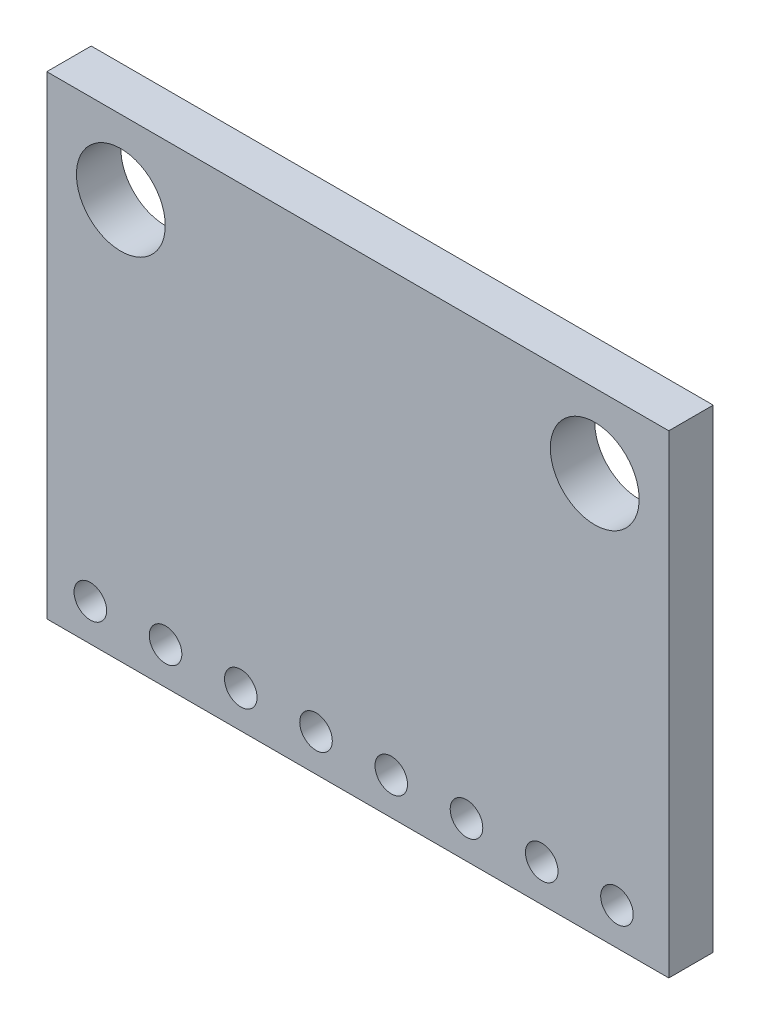
ISO-10303-21;
HEADER;
FILE_DESCRIPTION(('STEP AP214'),'2;1');
FILE_NAME('part.step','',(''),(''),'','','');
FILE_SCHEMA(('AUTOMOTIVE_DESIGN { 1 0 10303 214 1 1 1 1 }'));
ENDSEC;
DATA;
#1=APPLICATION_CONTEXT('core data for automotive mechanical design processes');
#2=APPLICATION_PROTOCOL_DEFINITION('international standard','automotive_design',2000,#1);
#3=PRODUCT_CONTEXT('',#1,'mechanical');
#4=PRODUCT('Part','Part','',(#3));
#5=PRODUCT_RELATED_PRODUCT_CATEGORY('part','',(#4));
#6=PRODUCT_DEFINITION_FORMATION('','',#4);
#7=PRODUCT_DEFINITION_CONTEXT('part definition',#1,'design');
#8=PRODUCT_DEFINITION('design','',#6,#7);
#9=PRODUCT_DEFINITION_SHAPE('','',#8);
#10=(LENGTH_UNIT() NAMED_UNIT(*) SI_UNIT(.MILLI.,.METRE.));
#11=(NAMED_UNIT(*) PLANE_ANGLE_UNIT() SI_UNIT($,.RADIAN.));
#12=(NAMED_UNIT(*) SI_UNIT($,.STERADIAN.) SOLID_ANGLE_UNIT());
#13=UNCERTAINTY_MEASURE_WITH_UNIT(LENGTH_MEASURE(1.E-05),#10,'distance_accuracy_value','');
#14=(GEOMETRIC_REPRESENTATION_CONTEXT(3) GLOBAL_UNCERTAINTY_ASSIGNED_CONTEXT((#13)) GLOBAL_UNIT_ASSIGNED_CONTEXT((#10,
#11,#12)) REPRESENTATION_CONTEXT('',''));
#15=CARTESIAN_POINT('',(0.,0.,0.));
#16=DIRECTION('',(0.,0.,1.));
#17=DIRECTION('',(1.,0.,0.));
#18=AXIS2_PLACEMENT_3D('',#15,#16,#17);
#19=CARTESIAN_POINT('',(0.,0.,1.5));
#20=DIRECTION('',(0.,0.,1.));
#21=DIRECTION('',(1.,0.,0.));
#22=AXIS2_PLACEMENT_3D('',#19,#20,#21);
#23=PLANE('',#22);
#24=CARTESIAN_POINT('',(8.75,-6.75,1.5));
#25=DIRECTION('',(0.,0.,1.));
#26=DIRECTION('',(1.,0.,0.));
#27=AXIS2_PLACEMENT_3D('',#24,#25,#26);
#28=CIRCLE('',#27,0.55);
#29=CARTESIAN_POINT('',(9.3,-6.75,1.5));
#30=VERTEX_POINT('',#29);
#31=EDGE_CURVE('E141',#30,#30,#28,.F.);
#32=ORIENTED_EDGE('',*,*,#31,.T.);
#33=EDGE_LOOP('',(#32));
#34=FACE_BOUND('',#33,.T.);
#35=CARTESIAN_POINT('',(6.21,-6.75,1.5));
#36=DIRECTION('',(0.,0.,1.));
#37=DIRECTION('',(1.,0.,0.));
#38=AXIS2_PLACEMENT_3D('',#35,#36,#37);
#39=CIRCLE('',#38,0.55);
#40=CARTESIAN_POINT('',(6.76,-6.75,1.5));
#41=VERTEX_POINT('',#40);
#42=EDGE_CURVE('E194',#41,#41,#39,.F.);
#43=ORIENTED_EDGE('',*,*,#42,.T.);
#44=EDGE_LOOP('',(#43));
#45=FACE_BOUND('',#44,.T.);
#46=CARTESIAN_POINT('',(3.67,-6.75,1.5));
#47=DIRECTION('',(0.,0.,1.));
#48=DIRECTION('',(1.,0.,0.));
#49=AXIS2_PLACEMENT_3D('',#46,#47,#48);
#50=CIRCLE('',#49,0.55);
#51=CARTESIAN_POINT('',(4.22,-6.75,1.5));
#52=VERTEX_POINT('',#51);
#53=EDGE_CURVE('E186',#52,#52,#50,.F.);
#54=ORIENTED_EDGE('',*,*,#53,.T.);
#55=EDGE_LOOP('',(#54));
#56=FACE_BOUND('',#55,.T.);
#57=CARTESIAN_POINT('',(1.13,-6.75,1.5));
#58=DIRECTION('',(0.,0.,1.));
#59=DIRECTION('',(1.,0.,0.));
#60=AXIS2_PLACEMENT_3D('',#57,#58,#59);
#61=CIRCLE('',#60,0.55);
#62=CARTESIAN_POINT('',(1.68,-6.75,1.5));
#63=VERTEX_POINT('',#62);
#64=EDGE_CURVE('E178',#63,#63,#61,.F.);
#65=ORIENTED_EDGE('',*,*,#64,.T.);
#66=EDGE_LOOP('',(#65));
#67=FACE_BOUND('',#66,.T.);
#68=CARTESIAN_POINT('',(-1.41,-6.75,1.5));
#69=DIRECTION('',(0.,0.,1.));
#70=DIRECTION('',(1.,0.,0.));
#71=AXIS2_PLACEMENT_3D('',#68,#69,#70);
#72=CIRCLE('',#71,0.55);
#73=CARTESIAN_POINT('',(-0.860000000000002,-6.75,1.5));
#74=VERTEX_POINT('',#73);
#75=EDGE_CURVE('E170',#74,#74,#72,.F.);
#76=ORIENTED_EDGE('',*,*,#75,.T.);
#77=EDGE_LOOP('',(#76));
#78=FACE_BOUND('',#77,.T.);
#79=CARTESIAN_POINT('',(-3.95,-6.75,1.5));
#80=DIRECTION('',(0.,0.,1.));
#81=DIRECTION('',(1.,0.,0.));
#82=AXIS2_PLACEMENT_3D('',#79,#80,#81);
#83=CIRCLE('',#82,0.55);
#84=CARTESIAN_POINT('',(-3.4,-6.75,1.5));
#85=VERTEX_POINT('',#84);
#86=EDGE_CURVE('E162',#85,#85,#83,.F.);
#87=ORIENTED_EDGE('',*,*,#86,.T.);
#88=EDGE_LOOP('',(#87));
#89=FACE_BOUND('',#88,.T.);
#90=CARTESIAN_POINT('',(-6.49,-6.75,1.5));
#91=DIRECTION('',(0.,0.,1.));
#92=DIRECTION('',(1.,0.,0.));
#93=AXIS2_PLACEMENT_3D('',#90,#91,#92);
#94=CIRCLE('',#93,0.55);
#95=CARTESIAN_POINT('',(-5.94,-6.75,1.5));
#96=VERTEX_POINT('',#95);
#97=EDGE_CURVE('E154',#96,#96,#94,.F.);
#98=ORIENTED_EDGE('',*,*,#97,.T.);
#99=EDGE_LOOP('',(#98));
#100=FACE_BOUND('',#99,.T.);
#101=CARTESIAN_POINT('',(-9.03,-6.75,1.5));
#102=DIRECTION('',(0.,0.,1.));
#103=DIRECTION('',(1.,0.,0.));
#104=AXIS2_PLACEMENT_3D('',#101,#102,#103);
#105=CIRCLE('',#104,0.55);
#106=CARTESIAN_POINT('',(-8.48,-6.75,1.5));
#107=VERTEX_POINT('',#106);
#108=EDGE_CURVE('E145',#107,#107,#105,.F.);
#109=ORIENTED_EDGE('',*,*,#108,.T.);
#110=EDGE_LOOP('',(#109));
#111=FACE_BOUND('',#110,.T.);
#112=CARTESIAN_POINT('',(-8.,5.5,1.5));
#113=DIRECTION('',(0.,0.,1.));
#114=DIRECTION('',(1.,0.,0.));
#115=AXIS2_PLACEMENT_3D('',#112,#113,#114);
#116=CIRCLE('',#115,1.5);
#117=CARTESIAN_POINT('',(-6.5,5.5,1.5));
#118=VERTEX_POINT('',#117);
#119=EDGE_CURVE('E111',#118,#118,#116,.T.);
#120=ORIENTED_EDGE('',*,*,#119,.F.);
#121=EDGE_LOOP('',(#120));
#122=FACE_BOUND('',#121,.T.);
#123=DIRECTION('',(0.,-1.,0.));
#124=VECTOR('',#123,1.);
#125=CARTESIAN_POINT('',(-10.5,-8.,1.5));
#126=LINE('',#125,#124);
#127=CARTESIAN_POINT('',(-10.5,8.,1.5));
#128=VERTEX_POINT('',#127);
#129=CARTESIAN_POINT('',(-10.5,-8.,1.5));
#130=VERTEX_POINT('',#129);
#131=EDGE_CURVE('E91',#128,#130,#126,.T.);
#132=ORIENTED_EDGE('',*,*,#131,.T.);
#133=DIRECTION('',(1.,0.,0.));
#134=VECTOR('',#133,1.);
#135=CARTESIAN_POINT('',(10.5,-8.,1.5));
#136=LINE('',#135,#134);
#137=CARTESIAN_POINT('',(10.5,-8.,1.5));
#138=VERTEX_POINT('',#137);
#139=EDGE_CURVE('E86',#130,#138,#136,.T.);
#140=ORIENTED_EDGE('',*,*,#139,.T.);
#141=DIRECTION('',(0.,1.,0.));
#142=VECTOR('',#141,1.);
#143=CARTESIAN_POINT('',(10.5,-8.,1.5));
#144=LINE('',#143,#142);
#145=CARTESIAN_POINT('',(10.5,8.,1.5));
#146=VERTEX_POINT('',#145);
#147=EDGE_CURVE('E89',#138,#146,#144,.T.);
#148=ORIENTED_EDGE('',*,*,#147,.T.);
#149=DIRECTION('',(-1.,0.,0.));
#150=VECTOR('',#149,1.);
#151=CARTESIAN_POINT('',(10.5,8.,1.5));
#152=LINE('',#151,#150);
#153=EDGE_CURVE('E56',#146,#128,#152,.T.);
#154=ORIENTED_EDGE('',*,*,#153,.T.);
#155=EDGE_LOOP('',(#132,#140,#148,#154));
#156=FACE_BOUND('',#155,.T.);
#157=CARTESIAN_POINT('',(8.,5.5,1.5));
#158=DIRECTION('',(0.,0.,1.));
#159=DIRECTION('',(-1.,0.,0.));
#160=AXIS2_PLACEMENT_3D('',#157,#158,#159);
#161=CIRCLE('',#160,1.5);
#162=CARTESIAN_POINT('',(6.5,5.5,1.5));
#163=VERTEX_POINT('',#162);
#164=EDGE_CURVE('E133',#163,#163,#161,.T.);
#165=ORIENTED_EDGE('',*,*,#164,.F.);
#166=EDGE_LOOP('',(#165));
#167=FACE_BOUND('',#166,.T.);
#168=ADVANCED_FACE('F38',(#34,#45,#56,#67,#78,#89,#100,#111,#122,#156,#167),#23,.T.);
#169=CARTESIAN_POINT('',(0.,0.,0.));
#170=DIRECTION('',(0.,0.,1.));
#171=DIRECTION('',(1.,0.,0.));
#172=AXIS2_PLACEMENT_3D('',#169,#170,#171);
#173=PLANE('',#172);
#174=CARTESIAN_POINT('',(8.75,-6.75,0.));
#175=DIRECTION('',(0.,0.,-1.));
#176=DIRECTION('',(-1.,0.,0.));
#177=AXIS2_PLACEMENT_3D('',#174,#175,#176);
#178=CIRCLE('',#177,0.55);
#179=CARTESIAN_POINT('',(8.2,-6.75,0.));
#180=VERTEX_POINT('',#179);
#181=EDGE_CURVE('E198',#180,#180,#178,.T.);
#182=ORIENTED_EDGE('',*,*,#181,.F.);
#183=EDGE_LOOP('',(#182));
#184=FACE_BOUND('',#183,.T.);
#185=CARTESIAN_POINT('',(6.21,-6.75,0.));
#186=DIRECTION('',(0.,0.,-1.));
#187=DIRECTION('',(-1.,0.,0.));
#188=AXIS2_PLACEMENT_3D('',#185,#186,#187);
#189=CIRCLE('',#188,0.55);
#190=CARTESIAN_POINT('',(5.66,-6.75,0.));
#191=VERTEX_POINT('',#190);
#192=EDGE_CURVE('E190',#191,#191,#189,.T.);
#193=ORIENTED_EDGE('',*,*,#192,.F.);
#194=EDGE_LOOP('',(#193));
#195=FACE_BOUND('',#194,.T.);
#196=CARTESIAN_POINT('',(3.67,-6.75,0.));
#197=DIRECTION('',(0.,0.,-1.));
#198=DIRECTION('',(-1.,0.,0.));
#199=AXIS2_PLACEMENT_3D('',#196,#197,#198);
#200=CIRCLE('',#199,0.55);
#201=CARTESIAN_POINT('',(3.12,-6.75,0.));
#202=VERTEX_POINT('',#201);
#203=EDGE_CURVE('E182',#202,#202,#200,.T.);
#204=ORIENTED_EDGE('',*,*,#203,.F.);
#205=EDGE_LOOP('',(#204));
#206=FACE_BOUND('',#205,.T.);
#207=CARTESIAN_POINT('',(1.13,-6.75,0.));
#208=DIRECTION('',(0.,0.,-1.));
#209=DIRECTION('',(-1.,0.,0.));
#210=AXIS2_PLACEMENT_3D('',#207,#208,#209);
#211=CIRCLE('',#210,0.55);
#212=CARTESIAN_POINT('',(0.579999999999999,-6.75,0.));
#213=VERTEX_POINT('',#212);
#214=EDGE_CURVE('E174',#213,#213,#211,.T.);
#215=ORIENTED_EDGE('',*,*,#214,.F.);
#216=EDGE_LOOP('',(#215));
#217=FACE_BOUND('',#216,.T.);
#218=CARTESIAN_POINT('',(-1.41,-6.75,0.));
#219=DIRECTION('',(0.,0.,-1.));
#220=DIRECTION('',(-1.,0.,0.));
#221=AXIS2_PLACEMENT_3D('',#218,#219,#220);
#222=CIRCLE('',#221,0.55);
#223=CARTESIAN_POINT('',(-1.96,-6.75,0.));
#224=VERTEX_POINT('',#223);
#225=EDGE_CURVE('E166',#224,#224,#222,.T.);
#226=ORIENTED_EDGE('',*,*,#225,.F.);
#227=EDGE_LOOP('',(#226));
#228=FACE_BOUND('',#227,.T.);
#229=CARTESIAN_POINT('',(-3.95,-6.75,0.));
#230=DIRECTION('',(0.,0.,-1.));
#231=DIRECTION('',(-1.,0.,0.));
#232=AXIS2_PLACEMENT_3D('',#229,#230,#231);
#233=CIRCLE('',#232,0.55);
#234=CARTESIAN_POINT('',(-4.5,-6.75,0.));
#235=VERTEX_POINT('',#234);
#236=EDGE_CURVE('E158',#235,#235,#233,.T.);
#237=ORIENTED_EDGE('',*,*,#236,.F.);
#238=EDGE_LOOP('',(#237));
#239=FACE_BOUND('',#238,.T.);
#240=CARTESIAN_POINT('',(-6.49,-6.75,0.));
#241=DIRECTION('',(0.,0.,-1.));
#242=DIRECTION('',(-1.,0.,0.));
#243=AXIS2_PLACEMENT_3D('',#240,#241,#242);
#244=CIRCLE('',#243,0.55);
#245=CARTESIAN_POINT('',(-7.04,-6.75,0.));
#246=VERTEX_POINT('',#245);
#247=EDGE_CURVE('E149',#246,#246,#244,.T.);
#248=ORIENTED_EDGE('',*,*,#247,.F.);
#249=EDGE_LOOP('',(#248));
#250=FACE_BOUND('',#249,.T.);
#251=CARTESIAN_POINT('',(-9.03,-6.75,0.));
#252=DIRECTION('',(0.,0.,-1.));
#253=DIRECTION('',(-1.,0.,0.));
#254=AXIS2_PLACEMENT_3D('',#251,#252,#253);
#255=CIRCLE('',#254,0.55);
#256=CARTESIAN_POINT('',(-9.58,-6.75,0.));
#257=VERTEX_POINT('',#256);
#258=EDGE_CURVE('E150',#257,#257,#255,.T.);
#259=ORIENTED_EDGE('',*,*,#258,.F.);
#260=EDGE_LOOP('',(#259));
#261=FACE_BOUND('',#260,.T.);
#262=DIRECTION('',(0.,-1.,0.));
#263=VECTOR('',#262,1.);
#264=CARTESIAN_POINT('',(-10.5,-8.,0.));
#265=LINE('',#264,#263);
#266=CARTESIAN_POINT('',(-10.5,8.,0.));
#267=VERTEX_POINT('',#266);
#268=CARTESIAN_POINT('',(-10.5,-8.,0.));
#269=VERTEX_POINT('',#268);
#270=EDGE_CURVE('E107',#267,#269,#265,.T.);
#271=ORIENTED_EDGE('',*,*,#270,.F.);
#272=DIRECTION('',(-1.,0.,0.));
#273=VECTOR('',#272,1.);
#274=CARTESIAN_POINT('',(10.5,8.,0.));
#275=LINE('',#274,#273);
#276=CARTESIAN_POINT('',(10.5,8.,0.));
#277=VERTEX_POINT('',#276);
#278=EDGE_CURVE('E79',#277,#267,#275,.T.);
#279=ORIENTED_EDGE('',*,*,#278,.F.);
#280=DIRECTION('',(0.,1.,0.));
#281=VECTOR('',#280,1.);
#282=CARTESIAN_POINT('',(10.5,-8.,0.));
#283=LINE('',#282,#281);
#284=CARTESIAN_POINT('',(10.5,-8.,0.));
#285=VERTEX_POINT('',#284);
#286=EDGE_CURVE('E73',#285,#277,#283,.T.);
#287=ORIENTED_EDGE('',*,*,#286,.F.);
#288=DIRECTION('',(1.,0.,0.));
#289=VECTOR('',#288,1.);
#290=CARTESIAN_POINT('',(10.5,-8.,0.));
#291=LINE('',#290,#289);
#292=EDGE_CURVE('E96',#269,#285,#291,.T.);
#293=ORIENTED_EDGE('',*,*,#292,.F.);
#294=EDGE_LOOP('',(#271,#279,#287,#293));
#295=FACE_BOUND('',#294,.T.);
#296=CARTESIAN_POINT('',(-8.,5.5,0.));
#297=DIRECTION('',(0.,0.,1.));
#298=DIRECTION('',(1.,0.,0.));
#299=AXIS2_PLACEMENT_3D('',#296,#297,#298);
#300=CIRCLE('',#299,1.5);
#301=CARTESIAN_POINT('',(-6.5,5.5,0.));
#302=VERTEX_POINT('',#301);
#303=EDGE_CURVE('E129',#302,#302,#300,.T.);
#304=ORIENTED_EDGE('',*,*,#303,.T.);
#305=EDGE_LOOP('',(#304));
#306=FACE_BOUND('',#305,.T.);
#307=CARTESIAN_POINT('',(8.,5.5,0.));
#308=DIRECTION('',(0.,0.,1.));
#309=DIRECTION('',(-1.,0.,0.));
#310=AXIS2_PLACEMENT_3D('',#307,#308,#309);
#311=CIRCLE('',#310,1.5);
#312=CARTESIAN_POINT('',(6.5,5.5,0.));
#313=VERTEX_POINT('',#312);
#314=EDGE_CURVE('E137',#313,#313,#311,.T.);
#315=ORIENTED_EDGE('',*,*,#314,.T.);
#316=EDGE_LOOP('',(#315));
#317=FACE_BOUND('',#316,.T.);
#318=ADVANCED_FACE('F124',(#184,#195,#206,#217,#228,#239,#250,#261,#295,#306,#317),#173,.F.);
#319=CARTESIAN_POINT('',(-10.5,-8.,1.5));
#320=DIRECTION('',(1.,0.,0.));
#321=DIRECTION('',(0.,0.,-1.));
#322=AXIS2_PLACEMENT_3D('',#319,#320,#321);
#323=PLANE('',#322);
#324=ORIENTED_EDGE('',*,*,#270,.T.);
#325=DIRECTION('',(0.,0.,-1.));
#326=VECTOR('',#325,1.);
#327=CARTESIAN_POINT('',(-10.5,-8.,1.5));
#328=LINE('',#327,#326);
#329=EDGE_CURVE('E11',#130,#269,#328,.T.);
#330=ORIENTED_EDGE('',*,*,#329,.F.);
#331=ORIENTED_EDGE('',*,*,#131,.F.);
#332=DIRECTION('',(0.,0.,-1.));
#333=VECTOR('',#332,1.);
#334=CARTESIAN_POINT('',(-10.5,8.,1.5));
#335=LINE('',#334,#333);
#336=EDGE_CURVE('E103',#128,#267,#335,.T.);
#337=ORIENTED_EDGE('',*,*,#336,.T.);
#338=EDGE_LOOP('',(#324,#330,#331,#337));
#339=FACE_BOUND('',#338,.T.);
#340=ADVANCED_FACE('F40',(#339),#323,.F.);
#341=CARTESIAN_POINT('',(10.5,-8.,1.5));
#342=DIRECTION('',(0.,1.,0.));
#343=DIRECTION('',(-1.,0.,0.));
#344=AXIS2_PLACEMENT_3D('',#341,#342,#343);
#345=PLANE('',#344);
#346=ORIENTED_EDGE('',*,*,#292,.T.);
#347=DIRECTION('',(0.,0.,-1.));
#348=VECTOR('',#347,1.);
#349=CARTESIAN_POINT('',(10.5,-8.,1.5));
#350=LINE('',#349,#348);
#351=EDGE_CURVE('E48',#138,#285,#350,.T.);
#352=ORIENTED_EDGE('',*,*,#351,.F.);
#353=ORIENTED_EDGE('',*,*,#139,.F.);
#354=ORIENTED_EDGE('',*,*,#329,.T.);
#355=EDGE_LOOP('',(#346,#352,#353,#354));
#356=FACE_BOUND('',#355,.T.);
#357=ADVANCED_FACE('F95',(#356),#345,.F.);
#358=CARTESIAN_POINT('',(10.5,-8.,1.5));
#359=DIRECTION('',(-1.,0.,0.));
#360=DIRECTION('',(0.,0.,1.));
#361=AXIS2_PLACEMENT_3D('',#358,#359,#360);
#362=PLANE('',#361);
#363=ORIENTED_EDGE('',*,*,#286,.T.);
#364=DIRECTION('',(0.,0.,-1.));
#365=VECTOR('',#364,1.);
#366=CARTESIAN_POINT('',(10.5,8.,1.5));
#367=LINE('',#366,#365);
#368=EDGE_CURVE('E98',#146,#277,#367,.T.);
#369=ORIENTED_EDGE('',*,*,#368,.F.);
#370=ORIENTED_EDGE('',*,*,#147,.F.);
#371=ORIENTED_EDGE('',*,*,#351,.T.);
#372=EDGE_LOOP('',(#363,#369,#370,#371));
#373=FACE_BOUND('',#372,.T.);
#374=ADVANCED_FACE('F99',(#373),#362,.F.);
#375=CARTESIAN_POINT('',(10.5,8.,1.5));
#376=DIRECTION('',(0.,-1.,0.));
#377=DIRECTION('',(1.,0.,0.));
#378=AXIS2_PLACEMENT_3D('',#375,#376,#377);
#379=PLANE('',#378);
#380=ORIENTED_EDGE('',*,*,#278,.T.);
#381=ORIENTED_EDGE('',*,*,#336,.F.);
#382=ORIENTED_EDGE('',*,*,#153,.F.);
#383=ORIENTED_EDGE('',*,*,#368,.T.);
#384=EDGE_LOOP('',(#380,#381,#382,#383));
#385=FACE_BOUND('',#384,.T.);
#386=ADVANCED_FACE('F121',(#385),#379,.F.);
#387=CARTESIAN_POINT('',(-8.,5.5,1.5));
#388=DIRECTION('',(0.,0.,-1.));
#389=DIRECTION('',(-1.,0.,0.));
#390=AXIS2_PLACEMENT_3D('',#387,#388,#389);
#391=CYLINDRICAL_SURFACE('',#390,1.5);
#392=ORIENTED_EDGE('',*,*,#119,.T.);
#393=EDGE_LOOP('',(#392));
#394=FACE_BOUND('',#393,.T.);
#395=ORIENTED_EDGE('',*,*,#303,.F.);
#396=EDGE_LOOP('',(#395));
#397=FACE_BOUND('',#396,.T.);
#398=ADVANCED_FACE('F243',(#394,#397),#391,.F.);
#399=CARTESIAN_POINT('',(8.,5.5,1.5));
#400=DIRECTION('',(0.,0.,-1.));
#401=DIRECTION('',(-1.,0.,0.));
#402=AXIS2_PLACEMENT_3D('',#399,#400,#401);
#403=CYLINDRICAL_SURFACE('',#402,1.5);
#404=ORIENTED_EDGE('',*,*,#164,.T.);
#405=EDGE_LOOP('',(#404));
#406=FACE_BOUND('',#405,.T.);
#407=ORIENTED_EDGE('',*,*,#314,.F.);
#408=EDGE_LOOP('',(#407));
#409=FACE_BOUND('',#408,.T.);
#410=ADVANCED_FACE('F233',(#406,#409),#403,.F.);
#411=CARTESIAN_POINT('',(-9.03,-6.75,3.05563491861041));
#412=DIRECTION('',(0.,0.,-1.));
#413=DIRECTION('',(-1.,0.,0.));
#414=AXIS2_PLACEMENT_3D('',#411,#412,#413);
#415=CYLINDRICAL_SURFACE('',#414,0.55);
#416=ORIENTED_EDGE('',*,*,#258,.T.);
#417=EDGE_LOOP('',(#416));
#418=FACE_BOUND('',#417,.T.);
#419=ORIENTED_EDGE('',*,*,#108,.F.);
#420=EDGE_LOOP('',(#419));
#421=FACE_BOUND('',#420,.T.);
#422=ADVANCED_FACE('F229',(#418,#421),#415,.F.);
#423=CARTESIAN_POINT('',(-6.49,-6.75,3.05563491861041));
#424=DIRECTION('',(0.,0.,-1.));
#425=DIRECTION('',(-1.,0.,0.));
#426=AXIS2_PLACEMENT_3D('',#423,#424,#425);
#427=CYLINDRICAL_SURFACE('',#426,0.55);
#428=ORIENTED_EDGE('',*,*,#247,.T.);
#429=EDGE_LOOP('',(#428));
#430=FACE_BOUND('',#429,.T.);
#431=ORIENTED_EDGE('',*,*,#97,.F.);
#432=EDGE_LOOP('',(#431));
#433=FACE_BOUND('',#432,.T.);
#434=ADVANCED_FACE('F232',(#430,#433),#427,.F.);
#435=CARTESIAN_POINT('',(-3.95,-6.75,3.05563491861041));
#436=DIRECTION('',(0.,0.,-1.));
#437=DIRECTION('',(-1.,0.,0.));
#438=AXIS2_PLACEMENT_3D('',#435,#436,#437);
#439=CYLINDRICAL_SURFACE('',#438,0.55);
#440=ORIENTED_EDGE('',*,*,#236,.T.);
#441=EDGE_LOOP('',(#440));
#442=FACE_BOUND('',#441,.T.);
#443=ORIENTED_EDGE('',*,*,#86,.F.);
#444=EDGE_LOOP('',(#443));
#445=FACE_BOUND('',#444,.T.);
#446=ADVANCED_FACE('F320',(#442,#445),#439,.F.);
#447=CARTESIAN_POINT('',(-1.41,-6.75,3.05563491861041));
#448=DIRECTION('',(0.,0.,-1.));
#449=DIRECTION('',(-1.,0.,0.));
#450=AXIS2_PLACEMENT_3D('',#447,#448,#449);
#451=CYLINDRICAL_SURFACE('',#450,0.55);
#452=ORIENTED_EDGE('',*,*,#225,.T.);
#453=EDGE_LOOP('',(#452));
#454=FACE_BOUND('',#453,.T.);
#455=ORIENTED_EDGE('',*,*,#75,.F.);
#456=EDGE_LOOP('',(#455));
#457=FACE_BOUND('',#456,.T.);
#458=ADVANCED_FACE('F328',(#454,#457),#451,.F.);
#459=CARTESIAN_POINT('',(1.13,-6.75,3.05563491861041));
#460=DIRECTION('',(0.,0.,-1.));
#461=DIRECTION('',(-1.,0.,0.));
#462=AXIS2_PLACEMENT_3D('',#459,#460,#461);
#463=CYLINDRICAL_SURFACE('',#462,0.55);
#464=ORIENTED_EDGE('',*,*,#214,.T.);
#465=EDGE_LOOP('',(#464));
#466=FACE_BOUND('',#465,.T.);
#467=ORIENTED_EDGE('',*,*,#64,.F.);
#468=EDGE_LOOP('',(#467));
#469=FACE_BOUND('',#468,.T.);
#470=ADVANCED_FACE('F337',(#466,#469),#463,.F.);
#471=CARTESIAN_POINT('',(3.67,-6.75,3.05563491861041));
#472=DIRECTION('',(0.,0.,-1.));
#473=DIRECTION('',(-1.,0.,0.));
#474=AXIS2_PLACEMENT_3D('',#471,#472,#473);
#475=CYLINDRICAL_SURFACE('',#474,0.55);
#476=ORIENTED_EDGE('',*,*,#203,.T.);
#477=EDGE_LOOP('',(#476));
#478=FACE_BOUND('',#477,.T.);
#479=ORIENTED_EDGE('',*,*,#53,.F.);
#480=EDGE_LOOP('',(#479));
#481=FACE_BOUND('',#480,.T.);
#482=ADVANCED_FACE('F346',(#478,#481),#475,.F.);
#483=CARTESIAN_POINT('',(6.21,-6.75,3.05563491861041));
#484=DIRECTION('',(0.,0.,-1.));
#485=DIRECTION('',(-1.,0.,0.));
#486=AXIS2_PLACEMENT_3D('',#483,#484,#485);
#487=CYLINDRICAL_SURFACE('',#486,0.55);
#488=ORIENTED_EDGE('',*,*,#192,.T.);
#489=EDGE_LOOP('',(#488));
#490=FACE_BOUND('',#489,.T.);
#491=ORIENTED_EDGE('',*,*,#42,.F.);
#492=EDGE_LOOP('',(#491));
#493=FACE_BOUND('',#492,.T.);
#494=ADVANCED_FACE('F355',(#490,#493),#487,.F.);
#495=CARTESIAN_POINT('',(8.75,-6.75,3.05563491861041));
#496=DIRECTION('',(0.,0.,-1.));
#497=DIRECTION('',(-1.,0.,0.));
#498=AXIS2_PLACEMENT_3D('',#495,#496,#497);
#499=CYLINDRICAL_SURFACE('',#498,0.55);
#500=ORIENTED_EDGE('',*,*,#181,.T.);
#501=EDGE_LOOP('',(#500));
#502=FACE_BOUND('',#501,.T.);
#503=ORIENTED_EDGE('',*,*,#31,.F.);
#504=EDGE_LOOP('',(#503));
#505=FACE_BOUND('',#504,.T.);
#506=ADVANCED_FACE('F209',(#502,#505),#499,.F.);
#507=CLOSED_SHELL('',(#168,#318,#340,#357,#374,#386,#398,#410,#422,#434,#446,#458,#470,#482,
#494,#506));
#508=MANIFOLD_SOLID_BREP('B2',#507);
#509=ADVANCED_BREP_SHAPE_REPRESENTATION('',(#18,#508),#14);
#510=SHAPE_DEFINITION_REPRESENTATION(#9,#509);
ENDSEC;
END-ISO-10303-21;
